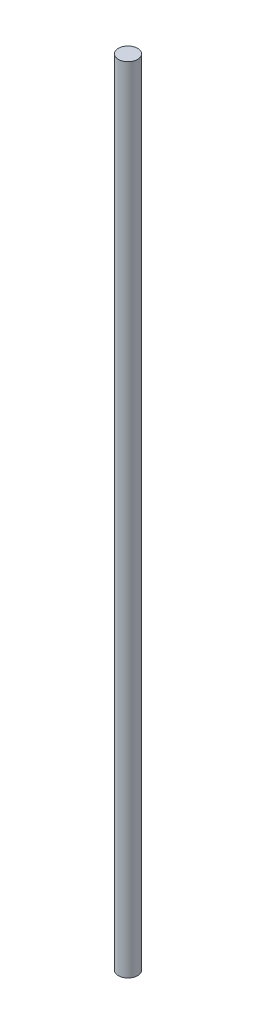
ISO-10303-21;
HEADER;
FILE_DESCRIPTION(('STEP AP214'),'2;1');
FILE_NAME('part.step','',(''),(''),'','','');
FILE_SCHEMA(('AUTOMOTIVE_DESIGN { 1 0 10303 214 1 1 1 1 }'));
ENDSEC;
DATA;
#1=APPLICATION_CONTEXT('core data for automotive mechanical design processes');
#2=APPLICATION_PROTOCOL_DEFINITION('international standard','automotive_design',2000,#1);
#3=PRODUCT_CONTEXT('',#1,'mechanical');
#4=PRODUCT('Part','Part','',(#3));
#5=PRODUCT_RELATED_PRODUCT_CATEGORY('part','',(#4));
#6=PRODUCT_DEFINITION_FORMATION('','',#4);
#7=PRODUCT_DEFINITION_CONTEXT('part definition',#1,'design');
#8=PRODUCT_DEFINITION('design','',#6,#7);
#9=PRODUCT_DEFINITION_SHAPE('','',#8);
#10=(LENGTH_UNIT() NAMED_UNIT(*) SI_UNIT(.MILLI.,.METRE.));
#11=(NAMED_UNIT(*) PLANE_ANGLE_UNIT() SI_UNIT($,.RADIAN.));
#12=(NAMED_UNIT(*) SI_UNIT($,.STERADIAN.) SOLID_ANGLE_UNIT());
#13=UNCERTAINTY_MEASURE_WITH_UNIT(LENGTH_MEASURE(1.E-05),#10,'distance_accuracy_value','');
#14=(GEOMETRIC_REPRESENTATION_CONTEXT(3) GLOBAL_UNCERTAINTY_ASSIGNED_CONTEXT((#13)) GLOBAL_UNIT_ASSIGNED_CONTEXT((#10,
#11,#12)) REPRESENTATION_CONTEXT('',''));
#15=CARTESIAN_POINT('',(0.,0.,0.));
#16=DIRECTION('',(0.,0.,1.));
#17=DIRECTION('',(1.,0.,0.));
#18=AXIS2_PLACEMENT_3D('',#15,#16,#17);
#19=CARTESIAN_POINT('',(0.,330.,0.));
#20=DIRECTION('',(0.,-1.,0.));
#21=DIRECTION('',(0.,0.,-1.));
#22=AXIS2_PLACEMENT_3D('',#19,#20,#21);
#23=CYLINDRICAL_SURFACE('',#22,4.);
#24=DIRECTION('',(0.,-1.,0.));
#25=VECTOR('',#24,1.);
#26=CARTESIAN_POINT('',(1.59782937498362,330.,-3.66700712958667));
#27=LINE('',#26,#25);
#28=CARTESIAN_POINT('',(1.59782937498362,321.861463725496,-3.66700712958667));
#29=VERTEX_POINT('',#28);
#30=CARTESIAN_POINT('',(1.59782937498362,325.942893790782,-3.66700712958667));
#31=VERTEX_POINT('',#30);
#32=EDGE_CURVE('E40',#29,#31,#27,.F.);
#33=ORIENTED_EDGE('',*,*,#32,.T.);
#34=CARTESIAN_POINT('',(0.,325.942893790782,0.));
#35=DIRECTION('',(0.,1.,0.));
#36=DIRECTION('',(0.,0.,1.));
#37=AXIS2_PLACEMENT_3D('',#34,#35,#36);
#38=CIRCLE('',#37,4.);
#39=CARTESIAN_POINT('',(-1.93649167310371,325.942893790782,-3.5));
#40=VERTEX_POINT('',#39);
#41=EDGE_CURVE('E11',#31,#40,#38,.T.);
#42=ORIENTED_EDGE('',*,*,#41,.T.);
#43=DIRECTION('',(0.,-1.,0.));
#44=VECTOR('',#43,1.);
#45=CARTESIAN_POINT('',(-1.93649167310371,330.,-3.5));
#46=LINE('',#45,#44);
#47=CARTESIAN_POINT('',(-1.93649167310371,321.861463725496,-3.5));
#48=VERTEX_POINT('',#47);
#49=EDGE_CURVE('E223',#40,#48,#46,.T.);
#50=ORIENTED_EDGE('',*,*,#49,.T.);
#51=CARTESIAN_POINT('',(0.,321.861463725496,0.));
#52=DIRECTION('',(0.,-1.,0.));
#53=DIRECTION('',(0.,0.,-1.));
#54=AXIS2_PLACEMENT_3D('',#51,#52,#53);
#55=CIRCLE('',#54,4.);
#56=EDGE_CURVE('E135',#48,#29,#55,.T.);
#57=ORIENTED_EDGE('',*,*,#56,.T.);
#58=EDGE_LOOP('',(#33,#42,#50,#57));
#59=FACE_BOUND('',#58,.T.);
#60=DIRECTION('',(0.,-1.,0.));
#61=VECTOR('',#60,1.);
#62=CARTESIAN_POINT('',(1.59782937498467,330.,-3.66700712958621));
#63=LINE('',#62,#61);
#64=CARTESIAN_POINT('',(1.59782937498467,221.861463725496,-3.66700712958621));
#65=VERTEX_POINT('',#64);
#66=CARTESIAN_POINT('',(1.59782937498467,225.942893790782,-3.66700712958621));
#67=VERTEX_POINT('',#66);
#68=EDGE_CURVE('E217',#65,#67,#63,.F.);
#69=ORIENTED_EDGE('',*,*,#68,.T.);
#70=CARTESIAN_POINT('',(0.,225.942893790782,0.));
#71=DIRECTION('',(0.,1.,0.));
#72=DIRECTION('',(0.,0.,1.));
#73=AXIS2_PLACEMENT_3D('',#70,#71,#72);
#74=CIRCLE('',#73,4.);
#75=CARTESIAN_POINT('',(-1.93649167310371,225.942893790782,-3.5));
#76=VERTEX_POINT('',#75);
#77=EDGE_CURVE('E220',#67,#76,#74,.T.);
#78=ORIENTED_EDGE('',*,*,#77,.T.);
#79=DIRECTION('',(0.,-1.,0.));
#80=VECTOR('',#79,1.);
#81=CARTESIAN_POINT('',(-1.93649167310371,330.,-3.5));
#82=LINE('',#81,#80);
#83=CARTESIAN_POINT('',(-1.93649167310371,221.861463725496,-3.5));
#84=VERTEX_POINT('',#83);
#85=EDGE_CURVE('E211',#76,#84,#82,.T.);
#86=ORIENTED_EDGE('',*,*,#85,.T.);
#87=CARTESIAN_POINT('',(0.,221.861463725496,0.));
#88=DIRECTION('',(0.,-1.,0.));
#89=DIRECTION('',(0.,0.,-1.));
#90=AXIS2_PLACEMENT_3D('',#87,#88,#89);
#91=CIRCLE('',#90,4.);
#92=EDGE_CURVE('E214',#84,#65,#91,.T.);
#93=ORIENTED_EDGE('',*,*,#92,.T.);
#94=EDGE_LOOP('',(#69,#78,#86,#93));
#95=FACE_BOUND('',#94,.T.);
#96=DIRECTION('',(0.,-1.,0.));
#97=VECTOR('',#96,1.);
#98=CARTESIAN_POINT('',(1.59782937498572,330.,-3.66700712958575));
#99=LINE('',#98,#97);
#100=CARTESIAN_POINT('',(1.59782937498572,121.861463725496,-3.66700712958575));
#101=VERTEX_POINT('',#100);
#102=CARTESIAN_POINT('',(1.59782937498572,125.942893790782,-3.66700712958575));
#103=VERTEX_POINT('',#102);
#104=EDGE_CURVE('E205',#101,#103,#99,.F.);
#105=ORIENTED_EDGE('',*,*,#104,.T.);
#106=CARTESIAN_POINT('',(0.,125.942893790782,0.));
#107=DIRECTION('',(0.,1.,0.));
#108=DIRECTION('',(0.,0.,1.));
#109=AXIS2_PLACEMENT_3D('',#106,#107,#108);
#110=CIRCLE('',#109,4.);
#111=CARTESIAN_POINT('',(-1.93649167310371,125.942893790782,-3.5));
#112=VERTEX_POINT('',#111);
#113=EDGE_CURVE('E208',#103,#112,#110,.T.);
#114=ORIENTED_EDGE('',*,*,#113,.T.);
#115=DIRECTION('',(0.,-1.,0.));
#116=VECTOR('',#115,1.);
#117=CARTESIAN_POINT('',(-1.93649167310371,330.,-3.5));
#118=LINE('',#117,#116);
#119=CARTESIAN_POINT('',(-1.93649167310371,121.861463725496,-3.5));
#120=VERTEX_POINT('',#119);
#121=EDGE_CURVE('E199',#112,#120,#118,.T.);
#122=ORIENTED_EDGE('',*,*,#121,.T.);
#123=CARTESIAN_POINT('',(0.,121.861463725496,0.));
#124=DIRECTION('',(0.,-1.,0.));
#125=DIRECTION('',(0.,0.,-1.));
#126=AXIS2_PLACEMENT_3D('',#123,#124,#125);
#127=CIRCLE('',#126,4.);
#128=EDGE_CURVE('E202',#120,#101,#127,.T.);
#129=ORIENTED_EDGE('',*,*,#128,.T.);
#130=EDGE_LOOP('',(#105,#114,#122,#129));
#131=FACE_BOUND('',#130,.T.);
#132=DIRECTION('',(0.,-1.,0.));
#133=VECTOR('',#132,1.);
#134=CARTESIAN_POINT('',(1.59782937498676,330.,-3.6670071295853));
#135=LINE('',#134,#133);
#136=CARTESIAN_POINT('',(1.59782937498676,21.8614637254955,-3.6670071295853));
#137=VERTEX_POINT('',#136);
#138=CARTESIAN_POINT('',(1.59782937498676,25.9428937907816,-3.6670071295853));
#139=VERTEX_POINT('',#138);
#140=EDGE_CURVE('E193',#137,#139,#135,.F.);
#141=ORIENTED_EDGE('',*,*,#140,.T.);
#142=CARTESIAN_POINT('',(0.,25.9428937907816,0.));
#143=DIRECTION('',(0.,1.,0.));
#144=DIRECTION('',(0.,0.,1.));
#145=AXIS2_PLACEMENT_3D('',#142,#143,#144);
#146=CIRCLE('',#145,4.);
#147=CARTESIAN_POINT('',(-1.93649167310371,25.9428937907816,-3.5));
#148=VERTEX_POINT('',#147);
#149=EDGE_CURVE('E196',#139,#148,#146,.T.);
#150=ORIENTED_EDGE('',*,*,#149,.T.);
#151=DIRECTION('',(0.,-1.,0.));
#152=VECTOR('',#151,1.);
#153=CARTESIAN_POINT('',(-1.93649167310371,330.,-3.5));
#154=LINE('',#153,#152);
#155=CARTESIAN_POINT('',(-1.93649167310371,21.8614637254955,-3.5));
#156=VERTEX_POINT('',#155);
#157=EDGE_CURVE('E185',#148,#156,#154,.T.);
#158=ORIENTED_EDGE('',*,*,#157,.T.);
#159=CARTESIAN_POINT('',(0.,21.8614637254955,0.));
#160=DIRECTION('',(0.,-1.,0.));
#161=DIRECTION('',(0.,0.,-1.));
#162=AXIS2_PLACEMENT_3D('',#159,#160,#161);
#163=CIRCLE('',#162,4.);
#164=EDGE_CURVE('E190',#156,#137,#163,.T.);
#165=ORIENTED_EDGE('',*,*,#164,.T.);
#166=EDGE_LOOP('',(#141,#150,#158,#165));
#167=FACE_BOUND('',#166,.T.);
#168=CARTESIAN_POINT('',(0.,330.,0.));
#169=DIRECTION('',(0.,1.,0.));
#170=DIRECTION('',(0.,0.,1.));
#171=AXIS2_PLACEMENT_3D('',#168,#169,#170);
#172=CIRCLE('',#171,4.);
#173=CARTESIAN_POINT('',(0.,330.,4.));
#174=VERTEX_POINT('',#173);
#175=EDGE_CURVE('E182',#174,#174,#172,.T.);
#176=ORIENTED_EDGE('',*,*,#175,.F.);
#177=EDGE_LOOP('',(#176));
#178=FACE_BOUND('',#177,.T.);
#179=CARTESIAN_POINT('',(0.,0.,0.));
#180=DIRECTION('',(0.,1.,0.));
#181=DIRECTION('',(0.,0.,1.));
#182=AXIS2_PLACEMENT_3D('',#179,#180,#181);
#183=CIRCLE('',#182,4.);
#184=CARTESIAN_POINT('',(0.,0.,4.));
#185=VERTEX_POINT('',#184);
#186=EDGE_CURVE('E144',#185,#185,#183,.T.);
#187=ORIENTED_EDGE('',*,*,#186,.T.);
#188=EDGE_LOOP('',(#187));
#189=FACE_BOUND('',#188,.T.);
#190=ADVANCED_FACE('F33',(#59,#95,#131,#167,#178,#189),#23,.T.);
#191=CARTESIAN_POINT('',(0.,330.,0.));
#192=DIRECTION('',(0.,1.,0.));
#193=DIRECTION('',(0.,0.,1.));
#194=AXIS2_PLACEMENT_3D('',#191,#192,#193);
#195=PLANE('',#194);
#196=ORIENTED_EDGE('',*,*,#175,.T.);
#197=EDGE_LOOP('',(#196));
#198=FACE_BOUND('',#197,.T.);
#199=ADVANCED_FACE('F241',(#198),#195,.T.);
#200=CARTESIAN_POINT('',(0.,0.,0.));
#201=DIRECTION('',(0.,1.,0.));
#202=DIRECTION('',(0.,0.,1.));
#203=AXIS2_PLACEMENT_3D('',#200,#201,#202);
#204=PLANE('',#203);
#205=ORIENTED_EDGE('',*,*,#186,.F.);
#206=EDGE_LOOP('',(#205));
#207=FACE_BOUND('',#206,.T.);
#208=ADVANCED_FACE('F247',(#207),#204,.F.);
#209=CARTESIAN_POINT('',(-2.31354110424575,25.9428937907816,-13.5));
#210=DIRECTION('',(0.,1.,0.));
#211=DIRECTION('',(0.,0.,1.));
#212=AXIS2_PLACEMENT_3D('',#209,#210,#211);
#213=PLANE('',#212);
#214=DIRECTION('',(0.,0.,1.));
#215=VECTOR('',#214,1.);
#216=CARTESIAN_POINT('',(1.59782937498676,25.9428937907816,-13.5));
#217=LINE('',#216,#215);
#218=CARTESIAN_POINT('',(1.59782937498676,25.9428937907816,-3.5));
#219=VERTEX_POINT('',#218);
#220=EDGE_CURVE('E161',#139,#219,#217,.T.);
#221=ORIENTED_EDGE('',*,*,#220,.T.);
#222=DIRECTION('',(-1.,0.,0.));
#223=VECTOR('',#222,1.);
#224=CARTESIAN_POINT('',(-2.31354110424575,25.9428937907816,-3.5));
#225=LINE('',#224,#223);
#226=EDGE_CURVE('E176',#219,#148,#225,.T.);
#227=ORIENTED_EDGE('',*,*,#226,.T.);
#228=ORIENTED_EDGE('',*,*,#149,.F.);
#229=EDGE_LOOP('',(#221,#227,#228));
#230=FACE_BOUND('',#229,.T.);
#231=ADVANCED_FACE('F253',(#230),#213,.F.);
#232=CARTESIAN_POINT('',(1.59782937498676,25.9428937907816,-13.5));
#233=DIRECTION('',(1.,0.,0.));
#234=DIRECTION('',(0.,0.,-1.));
#235=AXIS2_PLACEMENT_3D('',#232,#233,#234);
#236=PLANE('',#235);
#237=DIRECTION('',(0.,0.,1.));
#238=VECTOR('',#237,1.);
#239=CARTESIAN_POINT('',(1.59782937498676,21.8614637254955,-13.5));
#240=LINE('',#239,#238);
#241=CARTESIAN_POINT('',(1.59782937498676,21.8614637254955,-3.5));
#242=VERTEX_POINT('',#241);
#243=EDGE_CURVE('E179',#137,#242,#240,.T.);
#244=ORIENTED_EDGE('',*,*,#243,.T.);
#245=DIRECTION('',(0.,1.,0.));
#246=VECTOR('',#245,1.);
#247=CARTESIAN_POINT('',(1.59782937498676,25.9428937907816,-3.5));
#248=LINE('',#247,#246);
#249=EDGE_CURVE('E173',#242,#219,#248,.T.);
#250=ORIENTED_EDGE('',*,*,#249,.T.);
#251=ORIENTED_EDGE('',*,*,#220,.F.);
#252=ORIENTED_EDGE('',*,*,#140,.F.);
#253=EDGE_LOOP('',(#244,#250,#251,#252));
#254=FACE_BOUND('',#253,.T.);
#255=ADVANCED_FACE('F260',(#254),#236,.F.);
#256=CARTESIAN_POINT('',(-2.31354110424575,21.8614637254955,-13.5));
#257=DIRECTION('',(0.,-1.,0.));
#258=DIRECTION('',(0.,0.,-1.));
#259=AXIS2_PLACEMENT_3D('',#256,#257,#258);
#260=PLANE('',#259);
#261=DIRECTION('',(1.,0.,0.));
#262=VECTOR('',#261,1.);
#263=CARTESIAN_POINT('',(-2.31354110424575,21.8614637254955,-3.5));
#264=LINE('',#263,#262);
#265=EDGE_CURVE('E170',#156,#242,#264,.T.);
#266=ORIENTED_EDGE('',*,*,#265,.T.);
#267=ORIENTED_EDGE('',*,*,#243,.F.);
#268=ORIENTED_EDGE('',*,*,#164,.F.);
#269=EDGE_LOOP('',(#266,#267,#268));
#270=FACE_BOUND('',#269,.T.);
#271=ADVANCED_FACE('F256',(#270),#260,.F.);
#272=CARTESIAN_POINT('',(0.,0.,-3.5));
#273=DIRECTION('',(0.,0.,1.));
#274=DIRECTION('',(1.,0.,0.));
#275=AXIS2_PLACEMENT_3D('',#272,#273,#274);
#276=PLANE('',#275);
#277=ORIENTED_EDGE('',*,*,#226,.F.);
#278=ORIENTED_EDGE('',*,*,#249,.F.);
#279=ORIENTED_EDGE('',*,*,#265,.F.);
#280=ORIENTED_EDGE('',*,*,#157,.F.);
#281=EDGE_LOOP('',(#277,#278,#279,#280));
#282=FACE_BOUND('',#281,.T.);
#283=ADVANCED_FACE('F259',(#282),#276,.F.);
#284=CARTESIAN_POINT('',(-2.3135411042468,125.942893790782,-13.5));
#285=DIRECTION('',(0.,1.,0.));
#286=DIRECTION('',(0.,0.,1.));
#287=AXIS2_PLACEMENT_3D('',#284,#285,#286);
#288=PLANE('',#287);
#289=DIRECTION('',(0.,0.,1.));
#290=VECTOR('',#289,1.);
#291=CARTESIAN_POINT('',(1.59782937498572,125.942893790782,-13.5));
#292=LINE('',#291,#290);
#293=CARTESIAN_POINT('',(1.59782937498572,125.942893790782,-3.5));
#294=VERTEX_POINT('',#293);
#295=EDGE_CURVE('E148',#103,#294,#292,.T.);
#296=ORIENTED_EDGE('',*,*,#295,.T.);
#297=DIRECTION('',(-1.,0.,0.));
#298=VECTOR('',#297,1.);
#299=CARTESIAN_POINT('',(-2.3135411042468,125.942893790782,-3.5));
#300=LINE('',#299,#298);
#301=EDGE_CURVE('E164',#294,#112,#300,.T.);
#302=ORIENTED_EDGE('',*,*,#301,.T.);
#303=ORIENTED_EDGE('',*,*,#113,.F.);
#304=EDGE_LOOP('',(#296,#302,#303));
#305=FACE_BOUND('',#304,.T.);
#306=ADVANCED_FACE('F270',(#305),#288,.F.);
#307=CARTESIAN_POINT('',(1.59782937498572,125.942893790782,-13.5));
#308=DIRECTION('',(1.,0.,0.));
#309=DIRECTION('',(0.,0.,-1.));
#310=AXIS2_PLACEMENT_3D('',#307,#308,#309);
#311=PLANE('',#310);
#312=DIRECTION('',(0.,0.,1.));
#313=VECTOR('',#312,1.);
#314=CARTESIAN_POINT('',(1.59782937498572,121.861463725496,-13.5));
#315=LINE('',#314,#313);
#316=CARTESIAN_POINT('',(1.59782937498572,121.861463725496,-3.5));
#317=VERTEX_POINT('',#316);
#318=EDGE_CURVE('E167',#101,#317,#315,.T.);
#319=ORIENTED_EDGE('',*,*,#318,.T.);
#320=DIRECTION('',(0.,1.,0.));
#321=VECTOR('',#320,1.);
#322=CARTESIAN_POINT('',(1.59782937498572,125.942893790782,-3.5));
#323=LINE('',#322,#321);
#324=EDGE_CURVE('E160',#317,#294,#323,.T.);
#325=ORIENTED_EDGE('',*,*,#324,.T.);
#326=ORIENTED_EDGE('',*,*,#295,.F.);
#327=ORIENTED_EDGE('',*,*,#104,.F.);
#328=EDGE_LOOP('',(#319,#325,#326,#327));
#329=FACE_BOUND('',#328,.T.);
#330=ADVANCED_FACE('F276',(#329),#311,.F.);
#331=CARTESIAN_POINT('',(-2.3135411042468,121.861463725496,-13.5));
#332=DIRECTION('',(0.,-1.,0.));
#333=DIRECTION('',(0.,0.,-1.));
#334=AXIS2_PLACEMENT_3D('',#331,#332,#333);
#335=PLANE('',#334);
#336=DIRECTION('',(1.,0.,0.));
#337=VECTOR('',#336,1.);
#338=CARTESIAN_POINT('',(-2.3135411042468,121.861463725496,-3.5));
#339=LINE('',#338,#337);
#340=EDGE_CURVE('E157',#120,#317,#339,.T.);
#341=ORIENTED_EDGE('',*,*,#340,.T.);
#342=ORIENTED_EDGE('',*,*,#318,.F.);
#343=ORIENTED_EDGE('',*,*,#128,.F.);
#344=EDGE_LOOP('',(#341,#342,#343));
#345=FACE_BOUND('',#344,.T.);
#346=ADVANCED_FACE('F272',(#345),#335,.F.);
#347=CARTESIAN_POINT('',(0.,0.,-3.5));
#348=DIRECTION('',(0.,0.,1.));
#349=DIRECTION('',(1.,0.,0.));
#350=AXIS2_PLACEMENT_3D('',#347,#348,#349);
#351=PLANE('',#350);
#352=ORIENTED_EDGE('',*,*,#301,.F.);
#353=ORIENTED_EDGE('',*,*,#324,.F.);
#354=ORIENTED_EDGE('',*,*,#340,.F.);
#355=ORIENTED_EDGE('',*,*,#121,.F.);
#356=EDGE_LOOP('',(#352,#353,#354,#355));
#357=FACE_BOUND('',#356,.T.);
#358=ADVANCED_FACE('F275',(#357),#351,.F.);
#359=CARTESIAN_POINT('',(-2.31354110424784,225.942893790782,-13.5));
#360=DIRECTION('',(0.,1.,0.));
#361=DIRECTION('',(0.,0.,1.));
#362=AXIS2_PLACEMENT_3D('',#359,#360,#361);
#363=PLANE('',#362);
#364=DIRECTION('',(0.,0.,1.));
#365=VECTOR('',#364,1.);
#366=CARTESIAN_POINT('',(1.59782937498467,225.942893790782,-13.5));
#367=LINE('',#366,#365);
#368=CARTESIAN_POINT('',(1.59782937498467,225.942893790782,-3.5));
#369=VERTEX_POINT('',#368);
#370=EDGE_CURVE('E137',#67,#369,#367,.T.);
#371=ORIENTED_EDGE('',*,*,#370,.T.);
#372=DIRECTION('',(-1.,0.,0.));
#373=VECTOR('',#372,1.);
#374=CARTESIAN_POINT('',(-2.31354110424784,225.942893790782,-3.5));
#375=LINE('',#374,#373);
#376=EDGE_CURVE('E151',#369,#76,#375,.T.);
#377=ORIENTED_EDGE('',*,*,#376,.T.);
#378=ORIENTED_EDGE('',*,*,#77,.F.);
#379=EDGE_LOOP('',(#371,#377,#378));
#380=FACE_BOUND('',#379,.T.);
#381=ADVANCED_FACE('F286',(#380),#363,.F.);
#382=CARTESIAN_POINT('',(1.59782937498467,225.942893790782,-13.5));
#383=DIRECTION('',(1.,0.,0.));
#384=DIRECTION('',(0.,0.,-1.));
#385=AXIS2_PLACEMENT_3D('',#382,#383,#384);
#386=PLANE('',#385);
#387=DIRECTION('',(0.,0.,1.));
#388=VECTOR('',#387,1.);
#389=CARTESIAN_POINT('',(1.59782937498467,221.861463725496,-13.5));
#390=LINE('',#389,#388);
#391=CARTESIAN_POINT('',(1.59782937498467,221.861463725496,-3.5));
#392=VERTEX_POINT('',#391);
#393=EDGE_CURVE('E154',#65,#392,#390,.T.);
#394=ORIENTED_EDGE('',*,*,#393,.T.);
#395=DIRECTION('',(0.,1.,0.));
#396=VECTOR('',#395,1.);
#397=CARTESIAN_POINT('',(1.59782937498467,225.942893790782,-3.5));
#398=LINE('',#397,#396);
#399=EDGE_CURVE('E147',#392,#369,#398,.T.);
#400=ORIENTED_EDGE('',*,*,#399,.T.);
#401=ORIENTED_EDGE('',*,*,#370,.F.);
#402=ORIENTED_EDGE('',*,*,#68,.F.);
#403=EDGE_LOOP('',(#394,#400,#401,#402));
#404=FACE_BOUND('',#403,.T.);
#405=ADVANCED_FACE('F290',(#404),#386,.F.);
#406=CARTESIAN_POINT('',(-2.31354110424784,221.861463725496,-13.5));
#407=DIRECTION('',(0.,-1.,0.));
#408=DIRECTION('',(0.,0.,-1.));
#409=AXIS2_PLACEMENT_3D('',#406,#407,#408);
#410=PLANE('',#409);
#411=DIRECTION('',(1.,0.,0.));
#412=VECTOR('',#411,1.);
#413=CARTESIAN_POINT('',(-2.31354110424784,221.861463725496,-3.5));
#414=LINE('',#413,#412);
#415=EDGE_CURVE('E55',#84,#392,#414,.T.);
#416=ORIENTED_EDGE('',*,*,#415,.T.);
#417=ORIENTED_EDGE('',*,*,#393,.F.);
#418=ORIENTED_EDGE('',*,*,#92,.F.);
#419=EDGE_LOOP('',(#416,#417,#418));
#420=FACE_BOUND('',#419,.T.);
#421=ADVANCED_FACE('F237',(#420),#410,.F.);
#422=CARTESIAN_POINT('',(0.,0.,-3.5));
#423=DIRECTION('',(0.,0.,1.));
#424=DIRECTION('',(1.,0.,0.));
#425=AXIS2_PLACEMENT_3D('',#422,#423,#424);
#426=PLANE('',#425);
#427=ORIENTED_EDGE('',*,*,#376,.F.);
#428=ORIENTED_EDGE('',*,*,#399,.F.);
#429=ORIENTED_EDGE('',*,*,#415,.F.);
#430=ORIENTED_EDGE('',*,*,#85,.F.);
#431=EDGE_LOOP('',(#427,#428,#429,#430));
#432=FACE_BOUND('',#431,.T.);
#433=ADVANCED_FACE('F230',(#432),#426,.F.);
#434=CARTESIAN_POINT('',(-2.31354110424889,325.942893790782,-13.5));
#435=DIRECTION('',(0.,1.,0.));
#436=DIRECTION('',(0.,0.,1.));
#437=AXIS2_PLACEMENT_3D('',#434,#435,#436);
#438=PLANE('',#437);
#439=DIRECTION('',(0.,0.,1.));
#440=VECTOR('',#439,1.);
#441=CARTESIAN_POINT('',(1.59782937498362,325.942893790782,-13.5));
#442=LINE('',#441,#440);
#443=CARTESIAN_POINT('',(1.59782937498362,325.942893790782,-3.5));
#444=VERTEX_POINT('',#443);
#445=EDGE_CURVE('E131',#31,#444,#442,.T.);
#446=ORIENTED_EDGE('',*,*,#445,.T.);
#447=DIRECTION('',(-1.,0.,0.));
#448=VECTOR('',#447,1.);
#449=CARTESIAN_POINT('',(-2.31354110424889,325.942893790782,-3.5));
#450=LINE('',#449,#448);
#451=EDGE_CURVE('E132',#444,#40,#450,.T.);
#452=ORIENTED_EDGE('',*,*,#451,.T.);
#453=ORIENTED_EDGE('',*,*,#41,.F.);
#454=EDGE_LOOP('',(#446,#452,#453));
#455=FACE_BOUND('',#454,.T.);
#456=ADVANCED_FACE('F228',(#455),#438,.F.);
#457=CARTESIAN_POINT('',(1.59782937498362,325.942893790782,-13.5));
#458=DIRECTION('',(1.,0.,0.));
#459=DIRECTION('',(0.,0.,-1.));
#460=AXIS2_PLACEMENT_3D('',#457,#458,#459);
#461=PLANE('',#460);
#462=DIRECTION('',(0.,0.,1.));
#463=VECTOR('',#462,1.);
#464=CARTESIAN_POINT('',(1.59782937498362,321.861463725496,-13.5));
#465=LINE('',#464,#463);
#466=CARTESIAN_POINT('',(1.59782937498362,321.861463725496,-3.5));
#467=VERTEX_POINT('',#466);
#468=EDGE_CURVE('E123',#29,#467,#465,.T.);
#469=ORIENTED_EDGE('',*,*,#468,.T.);
#470=DIRECTION('',(0.,1.,0.));
#471=VECTOR('',#470,1.);
#472=CARTESIAN_POINT('',(1.59782937498362,325.942893790782,-3.5));
#473=LINE('',#472,#471);
#474=EDGE_CURVE('E126',#467,#444,#473,.T.);
#475=ORIENTED_EDGE('',*,*,#474,.T.);
#476=ORIENTED_EDGE('',*,*,#445,.F.);
#477=ORIENTED_EDGE('',*,*,#32,.F.);
#478=EDGE_LOOP('',(#469,#475,#476,#477));
#479=FACE_BOUND('',#478,.T.);
#480=ADVANCED_FACE('F124',(#479),#461,.F.);
#481=CARTESIAN_POINT('',(-2.31354110424889,321.861463725496,-13.5));
#482=DIRECTION('',(0.,-1.,0.));
#483=DIRECTION('',(0.,0.,-1.));
#484=AXIS2_PLACEMENT_3D('',#481,#482,#483);
#485=PLANE('',#484);
#486=DIRECTION('',(1.,0.,0.));
#487=VECTOR('',#486,1.);
#488=CARTESIAN_POINT('',(-2.31354110424889,321.861463725496,-3.5));
#489=LINE('',#488,#487);
#490=EDGE_CURVE('E47',#48,#467,#489,.T.);
#491=ORIENTED_EDGE('',*,*,#490,.T.);
#492=ORIENTED_EDGE('',*,*,#468,.F.);
#493=ORIENTED_EDGE('',*,*,#56,.F.);
#494=EDGE_LOOP('',(#491,#492,#493));
#495=FACE_BOUND('',#494,.T.);
#496=ADVANCED_FACE('F134',(#495),#485,.F.);
#497=CARTESIAN_POINT('',(0.,0.,-3.5));
#498=DIRECTION('',(0.,0.,1.));
#499=DIRECTION('',(1.,0.,0.));
#500=AXIS2_PLACEMENT_3D('',#497,#498,#499);
#501=PLANE('',#500);
#502=ORIENTED_EDGE('',*,*,#451,.F.);
#503=ORIENTED_EDGE('',*,*,#474,.F.);
#504=ORIENTED_EDGE('',*,*,#490,.F.);
#505=ORIENTED_EDGE('',*,*,#49,.F.);
#506=EDGE_LOOP('',(#502,#503,#504,#505));
#507=FACE_BOUND('',#506,.T.);
#508=ADVANCED_FACE('F139',(#507),#501,.F.);
#509=CLOSED_SHELL('',(#190,#199,#208,#231,#255,#271,#283,#306,#330,#346,#358,#381,#405,#421,
#433,#456,#480,#496,#508));
#510=MANIFOLD_SOLID_BREP('B2',#509);
#511=ADVANCED_BREP_SHAPE_REPRESENTATION('',(#18,#510),#14);
#512=SHAPE_DEFINITION_REPRESENTATION(#9,#511);
ENDSEC;
END-ISO-10303-21;
